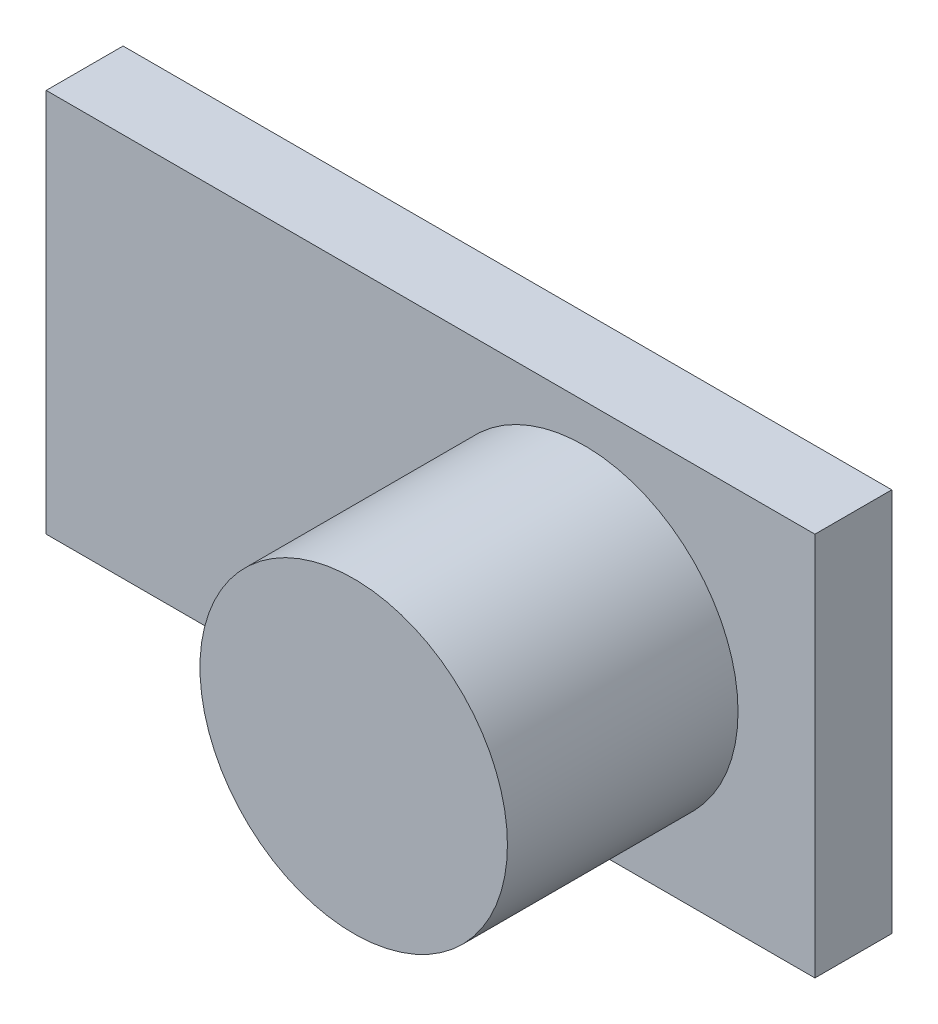
ISO-10303-21;
HEADER;
FILE_DESCRIPTION(('STEP AP214'),'2;1');
FILE_NAME('part.step','',(''),(''),'','','');
FILE_SCHEMA(('AUTOMOTIVE_DESIGN { 1 0 10303 214 1 1 1 1 }'));
ENDSEC;
DATA;
#1=APPLICATION_CONTEXT('core data for automotive mechanical design processes');
#2=APPLICATION_PROTOCOL_DEFINITION('international standard','automotive_design',2000,#1);
#3=PRODUCT_CONTEXT('',#1,'mechanical');
#4=PRODUCT('Part','Part','',(#3));
#5=PRODUCT_RELATED_PRODUCT_CATEGORY('part','',(#4));
#6=PRODUCT_DEFINITION_FORMATION('','',#4);
#7=PRODUCT_DEFINITION_CONTEXT('part definition',#1,'design');
#8=PRODUCT_DEFINITION('design','',#6,#7);
#9=PRODUCT_DEFINITION_SHAPE('','',#8);
#10=(LENGTH_UNIT() NAMED_UNIT(*) SI_UNIT(.MILLI.,.METRE.));
#11=(NAMED_UNIT(*) PLANE_ANGLE_UNIT() SI_UNIT($,.RADIAN.));
#12=(NAMED_UNIT(*) SI_UNIT($,.STERADIAN.) SOLID_ANGLE_UNIT());
#13=UNCERTAINTY_MEASURE_WITH_UNIT(LENGTH_MEASURE(1.E-05),#10,'distance_accuracy_value','');
#14=(GEOMETRIC_REPRESENTATION_CONTEXT(3) GLOBAL_UNCERTAINTY_ASSIGNED_CONTEXT((#13)) GLOBAL_UNIT_ASSIGNED_CONTEXT((#10,
#11,#12)) REPRESENTATION_CONTEXT('',''));
#15=CARTESIAN_POINT('',(0.,0.,0.));
#16=DIRECTION('',(0.,0.,1.));
#17=DIRECTION('',(1.,0.,0.));
#18=AXIS2_PLACEMENT_3D('',#15,#16,#17);
#19=CARTESIAN_POINT('',(-10.,-22.096458497182,2.));
#20=DIRECTION('',(1.,0.,0.));
#21=DIRECTION('',(0.,1.,0.));
#22=AXIS2_PLACEMENT_3D('',#19,#20,#21);
#23=PLANE('',#22);
#24=DIRECTION('',(0.,-1.,0.));
#25=VECTOR('',#24,1.);
#26=CARTESIAN_POINT('',(-10.,-22.096458497182,0.));
#27=LINE('',#26,#25);
#28=CARTESIAN_POINT('',(-10.,-22.096458497182,0.));
#29=VERTEX_POINT('',#28);
#30=CARTESIAN_POINT('',(-10.,-32.096458497182,0.));
#31=VERTEX_POINT('',#30);
#32=EDGE_CURVE('E99',#29,#31,#27,.T.);
#33=ORIENTED_EDGE('',*,*,#32,.T.);
#34=DIRECTION('',(0.,0.,-1.));
#35=VECTOR('',#34,1.);
#36=CARTESIAN_POINT('',(-10.,-32.096458497182,2.));
#37=LINE('',#36,#35);
#38=CARTESIAN_POINT('',(-10.,-32.096458497182,2.));
#39=VERTEX_POINT('',#38);
#40=EDGE_CURVE('E36',#39,#31,#37,.T.);
#41=ORIENTED_EDGE('',*,*,#40,.F.);
#42=DIRECTION('',(0.,-1.,0.));
#43=VECTOR('',#42,1.);
#44=CARTESIAN_POINT('',(-10.,-22.096458497182,2.));
#45=LINE('',#44,#43);
#46=CARTESIAN_POINT('',(-10.,-22.096458497182,2.));
#47=VERTEX_POINT('',#46);
#48=EDGE_CURVE('E86',#47,#39,#45,.T.);
#49=ORIENTED_EDGE('',*,*,#48,.F.);
#50=DIRECTION('',(0.,0.,-1.));
#51=VECTOR('',#50,1.);
#52=CARTESIAN_POINT('',(-10.,-22.096458497182,2.));
#53=LINE('',#52,#51);
#54=EDGE_CURVE('E95',#47,#29,#53,.T.);
#55=ORIENTED_EDGE('',*,*,#54,.T.);
#56=EDGE_LOOP('',(#33,#41,#49,#55));
#57=FACE_BOUND('',#56,.T.);
#58=ADVANCED_FACE('F33',(#57),#23,.F.);
#59=CARTESIAN_POINT('',(-10.,-32.096458497182,2.));
#60=DIRECTION('',(0.,1.,0.));
#61=DIRECTION('',(0.,0.,1.));
#62=AXIS2_PLACEMENT_3D('',#59,#60,#61);
#63=PLANE('',#62);
#64=DIRECTION('',(1.,0.,0.));
#65=VECTOR('',#64,1.);
#66=CARTESIAN_POINT('',(-10.,-32.096458497182,0.));
#67=LINE('',#66,#65);
#68=CARTESIAN_POINT('',(10.,-32.096458497182,0.));
#69=VERTEX_POINT('',#68);
#70=EDGE_CURVE('E91',#31,#69,#67,.T.);
#71=ORIENTED_EDGE('',*,*,#70,.T.);
#72=DIRECTION('',(0.,0.,-1.));
#73=VECTOR('',#72,1.);
#74=CARTESIAN_POINT('',(10.,-32.096458497182,2.));
#75=LINE('',#74,#73);
#76=CARTESIAN_POINT('',(10.,-32.096458497182,2.));
#77=VERTEX_POINT('',#76);
#78=EDGE_CURVE('E89',#77,#69,#75,.T.);
#79=ORIENTED_EDGE('',*,*,#78,.F.);
#80=DIRECTION('',(1.,0.,0.));
#81=VECTOR('',#80,1.);
#82=CARTESIAN_POINT('',(-10.,-32.096458497182,2.));
#83=LINE('',#82,#81);
#84=EDGE_CURVE('E81',#39,#77,#83,.T.);
#85=ORIENTED_EDGE('',*,*,#84,.F.);
#86=ORIENTED_EDGE('',*,*,#40,.T.);
#87=EDGE_LOOP('',(#71,#79,#85,#86));
#88=FACE_BOUND('',#87,.T.);
#89=ADVANCED_FACE('F90',(#88),#63,.F.);
#90=CARTESIAN_POINT('',(10.,-22.096458497182,2.));
#91=DIRECTION('',(-1.,0.,0.));
#92=DIRECTION('',(0.,-1.,0.));
#93=AXIS2_PLACEMENT_3D('',#90,#91,#92);
#94=PLANE('',#93);
#95=DIRECTION('',(0.,1.,0.));
#96=VECTOR('',#95,1.);
#97=CARTESIAN_POINT('',(10.,-22.096458497182,0.));
#98=LINE('',#97,#96);
#99=CARTESIAN_POINT('',(10.,-22.096458497182,0.));
#100=VERTEX_POINT('',#99);
#101=EDGE_CURVE('E67',#69,#100,#98,.T.);
#102=ORIENTED_EDGE('',*,*,#101,.T.);
#103=DIRECTION('',(0.,0.,-1.));
#104=VECTOR('',#103,1.);
#105=CARTESIAN_POINT('',(10.,-22.096458497182,2.));
#106=LINE('',#105,#104);
#107=CARTESIAN_POINT('',(10.,-22.096458497182,2.));
#108=VERTEX_POINT('',#107);
#109=EDGE_CURVE('E92',#108,#100,#106,.T.);
#110=ORIENTED_EDGE('',*,*,#109,.F.);
#111=DIRECTION('',(0.,1.,0.));
#112=VECTOR('',#111,1.);
#113=CARTESIAN_POINT('',(10.,-22.096458497182,2.));
#114=LINE('',#113,#112);
#115=EDGE_CURVE('E84',#77,#108,#114,.T.);
#116=ORIENTED_EDGE('',*,*,#115,.F.);
#117=ORIENTED_EDGE('',*,*,#78,.T.);
#118=EDGE_LOOP('',(#102,#110,#116,#117));
#119=FACE_BOUND('',#118,.T.);
#120=ADVANCED_FACE('F93',(#119),#94,.F.);
#121=CARTESIAN_POINT('',(-10.,-22.096458497182,2.));
#122=DIRECTION('',(0.,-1.,0.));
#123=DIRECTION('',(0.,0.,-1.));
#124=AXIS2_PLACEMENT_3D('',#121,#122,#123);
#125=PLANE('',#124);
#126=DIRECTION('',(-1.,0.,0.));
#127=VECTOR('',#126,1.);
#128=CARTESIAN_POINT('',(-10.,-22.096458497182,0.));
#129=LINE('',#128,#127);
#130=EDGE_CURVE('E73',#100,#29,#129,.T.);
#131=ORIENTED_EDGE('',*,*,#130,.T.);
#132=ORIENTED_EDGE('',*,*,#54,.F.);
#133=DIRECTION('',(-1.,0.,0.));
#134=VECTOR('',#133,1.);
#135=CARTESIAN_POINT('',(-10.,-22.096458497182,2.));
#136=LINE('',#135,#134);
#137=EDGE_CURVE('E50',#108,#47,#136,.T.);
#138=ORIENTED_EDGE('',*,*,#137,.F.);
#139=ORIENTED_EDGE('',*,*,#109,.T.);
#140=EDGE_LOOP('',(#131,#132,#138,#139));
#141=FACE_BOUND('',#140,.T.);
#142=ADVANCED_FACE('F107',(#141),#125,.F.);
#143=CARTESIAN_POINT('',(0.,0.,2.));
#144=DIRECTION('',(0.,0.,1.));
#145=DIRECTION('',(1.,0.,0.));
#146=AXIS2_PLACEMENT_3D('',#143,#144,#145);
#147=PLANE('',#146);
#148=CARTESIAN_POINT('',(4.,-27.096458497182,2.));
#149=DIRECTION('',(0.,0.,1.));
#150=DIRECTION('',(1.,0.,0.));
#151=AXIS2_PLACEMENT_3D('',#148,#149,#150);
#152=CIRCLE('',#151,4.);
#153=CARTESIAN_POINT('',(8.,-27.096458497182,2.));
#154=VERTEX_POINT('',#153);
#155=EDGE_CURVE('E11',#154,#154,#152,.T.);
#156=ORIENTED_EDGE('',*,*,#155,.F.);
#157=EDGE_LOOP('',(#156));
#158=FACE_BOUND('',#157,.T.);
#159=ORIENTED_EDGE('',*,*,#48,.T.);
#160=ORIENTED_EDGE('',*,*,#84,.T.);
#161=ORIENTED_EDGE('',*,*,#115,.T.);
#162=ORIENTED_EDGE('',*,*,#137,.T.);
#163=EDGE_LOOP('',(#159,#160,#161,#162));
#164=FACE_BOUND('',#163,.T.);
#165=ADVANCED_FACE('F82',(#158,#164),#147,.T.);
#166=CARTESIAN_POINT('',(0.,0.,0.));
#167=DIRECTION('',(0.,0.,1.));
#168=DIRECTION('',(1.,0.,0.));
#169=AXIS2_PLACEMENT_3D('',#166,#167,#168);
#170=PLANE('',#169);
#171=ORIENTED_EDGE('',*,*,#32,.F.);
#172=ORIENTED_EDGE('',*,*,#130,.F.);
#173=ORIENTED_EDGE('',*,*,#101,.F.);
#174=ORIENTED_EDGE('',*,*,#70,.F.);
#175=EDGE_LOOP('',(#171,#172,#173,#174));
#176=FACE_BOUND('',#175,.T.);
#177=ADVANCED_FACE('F110',(#176),#170,.F.);
#178=CARTESIAN_POINT('',(4.,-27.096458497182,8.));
#179=DIRECTION('',(0.,0.,-1.));
#180=DIRECTION('',(-1.,0.,0.));
#181=AXIS2_PLACEMENT_3D('',#178,#179,#180);
#182=CYLINDRICAL_SURFACE('',#181,4.);
#183=CARTESIAN_POINT('',(4.,-27.096458497182,8.));
#184=DIRECTION('',(0.,0.,1.));
#185=DIRECTION('',(1.,0.,0.));
#186=AXIS2_PLACEMENT_3D('',#183,#184,#185);
#187=CIRCLE('',#186,4.);
#188=CARTESIAN_POINT('',(8.,-27.096458497182,8.));
#189=VERTEX_POINT('',#188);
#190=EDGE_CURVE('E102',#189,#189,#187,.T.);
#191=ORIENTED_EDGE('',*,*,#190,.F.);
#192=EDGE_LOOP('',(#191));
#193=FACE_BOUND('',#192,.T.);
#194=ORIENTED_EDGE('',*,*,#155,.T.);
#195=EDGE_LOOP('',(#194));
#196=FACE_BOUND('',#195,.T.);
#197=ADVANCED_FACE('F118',(#193,#196),#182,.T.);
#198=CARTESIAN_POINT('',(4.,-27.096458497182,8.));
#199=DIRECTION('',(0.,0.,1.));
#200=DIRECTION('',(1.,0.,0.));
#201=AXIS2_PLACEMENT_3D('',#198,#199,#200);
#202=PLANE('',#201);
#203=ORIENTED_EDGE('',*,*,#190,.T.);
#204=EDGE_LOOP('',(#203));
#205=FACE_BOUND('',#204,.T.);
#206=ADVANCED_FACE('F116',(#205),#202,.T.);
#207=CLOSED_SHELL('',(#58,#89,#120,#142,#165,#177,#197,#206));
#208=MANIFOLD_SOLID_BREP('B2',#207);
#209=ADVANCED_BREP_SHAPE_REPRESENTATION('',(#18,#208),#14);
#210=SHAPE_DEFINITION_REPRESENTATION(#9,#209);
ENDSEC;
END-ISO-10303-21;
